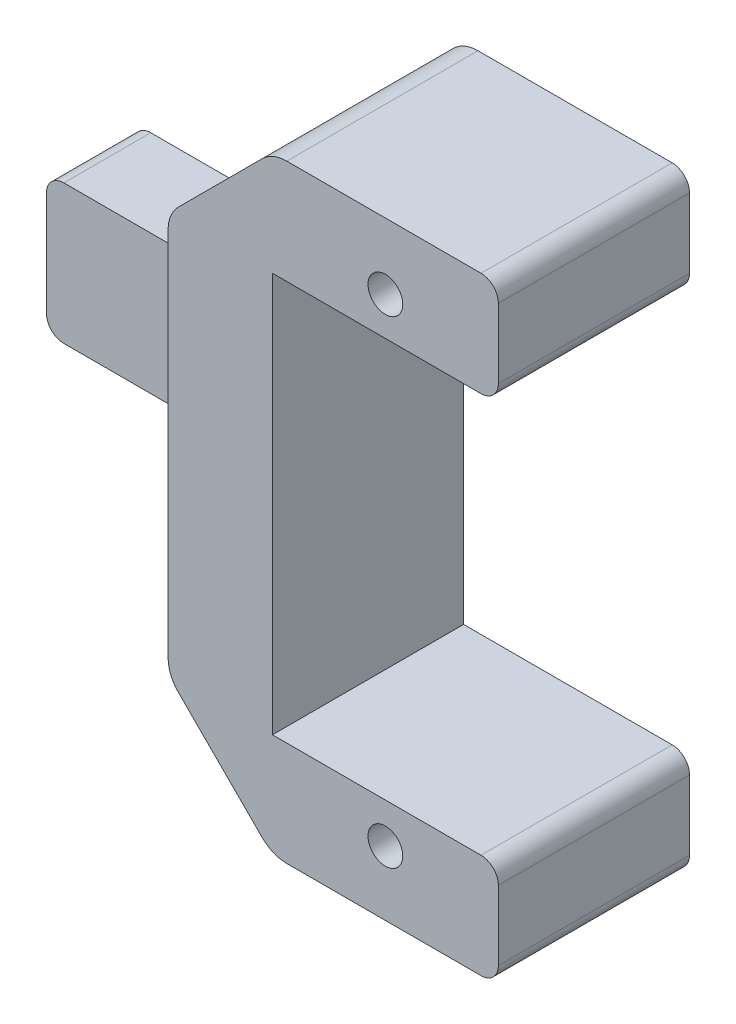
ISO-10303-21;
HEADER;
FILE_DESCRIPTION(('STEP AP214'),'2;1');
FILE_NAME('part.step','',(''),(''),'','','');
FILE_SCHEMA(('AUTOMOTIVE_DESIGN { 1 0 10303 214 1 1 1 1 }'));
ENDSEC;
DATA;
#1=APPLICATION_CONTEXT('core data for automotive mechanical design processes');
#2=APPLICATION_PROTOCOL_DEFINITION('international standard','automotive_design',2000,#1);
#3=PRODUCT_CONTEXT('',#1,'mechanical');
#4=PRODUCT('Part','Part','',(#3));
#5=PRODUCT_RELATED_PRODUCT_CATEGORY('part','',(#4));
#6=PRODUCT_DEFINITION_FORMATION('','',#4);
#7=PRODUCT_DEFINITION_CONTEXT('part definition',#1,'design');
#8=PRODUCT_DEFINITION('design','',#6,#7);
#9=PRODUCT_DEFINITION_SHAPE('','',#8);
#10=(LENGTH_UNIT() NAMED_UNIT(*) SI_UNIT(.MILLI.,.METRE.));
#11=(NAMED_UNIT(*) PLANE_ANGLE_UNIT() SI_UNIT($,.RADIAN.));
#12=(NAMED_UNIT(*) SI_UNIT($,.STERADIAN.) SOLID_ANGLE_UNIT());
#13=UNCERTAINTY_MEASURE_WITH_UNIT(LENGTH_MEASURE(1.E-05),#10,'distance_accuracy_value','');
#14=(GEOMETRIC_REPRESENTATION_CONTEXT(3) GLOBAL_UNCERTAINTY_ASSIGNED_CONTEXT((#13)) GLOBAL_UNIT_ASSIGNED_CONTEXT((#10,
#11,#12)) REPRESENTATION_CONTEXT('',''));
#15=CARTESIAN_POINT('',(0.,0.,0.));
#16=DIRECTION('',(0.,0.,1.));
#17=DIRECTION('',(1.,0.,0.));
#18=AXIS2_PLACEMENT_3D('',#15,#16,#17);
#19=CARTESIAN_POINT('',(-72.397881044612,25.5979659021644,11.));
#20=DIRECTION('',(0.,-1.,0.));
#21=DIRECTION('',(0.,0.,-1.));
#22=AXIS2_PLACEMENT_3D('',#19,#20,#21);
#23=PLANE('',#22);
#24=CARTESIAN_POINT('',(-78.897881044612,25.5979659021644,2.));
#25=DIRECTION('',(0.,1.,0.));
#26=DIRECTION('',(0.,0.,1.));
#27=AXIS2_PLACEMENT_3D('',#24,#25,#26);
#28=CIRCLE('',#27,0.999999999999998);
#29=CARTESIAN_POINT('',(-78.897881044612,25.5979659021644,3.));
#30=VERTEX_POINT('',#29);
#31=EDGE_CURVE('E272',#30,#30,#28,.T.);
#32=ORIENTED_EDGE('',*,*,#31,.F.);
#33=EDGE_LOOP('',(#32));
#34=FACE_BOUND('',#33,.T.);
#35=DIRECTION('',(-1.,0.,0.));
#36=VECTOR('',#35,1.);
#37=CARTESIAN_POINT('',(-72.397881044612,25.5979659021644,5.));
#38=LINE('',#37,#36);
#39=CARTESIAN_POINT('',(-72.397881044612,25.5979659021644,5.));
#40=VERTEX_POINT('',#39);
#41=CARTESIAN_POINT('',(-84.397881044612,25.5979659021644,5.));
#42=VERTEX_POINT('',#41);
#43=EDGE_CURVE('E205',#40,#42,#38,.T.);
#44=ORIENTED_EDGE('',*,*,#43,.F.);
#45=DIRECTION('',(0.,0.,-1.));
#46=VECTOR('',#45,1.);
#47=CARTESIAN_POINT('',(-72.397881044612,25.5979659021644,11.));
#48=LINE('',#47,#46);
#49=CARTESIAN_POINT('',(-72.397881044612,25.5979659021644,0.));
#50=VERTEX_POINT('',#49);
#51=EDGE_CURVE('E202',#40,#50,#48,.T.);
#52=ORIENTED_EDGE('',*,*,#51,.T.);
#53=DIRECTION('',(-1.,0.,0.));
#54=VECTOR('',#53,1.);
#55=CARTESIAN_POINT('',(-72.397881044612,25.5979659021644,0.));
#56=LINE('',#55,#54);
#57=CARTESIAN_POINT('',(-84.397881044612,25.5979659021644,0.));
#58=VERTEX_POINT('',#57);
#59=EDGE_CURVE('E315',#50,#58,#56,.T.);
#60=ORIENTED_EDGE('',*,*,#59,.T.);
#61=DIRECTION('',(0.,0.,-1.));
#62=VECTOR('',#61,1.);
#63=CARTESIAN_POINT('',(-84.397881044612,25.5979659021644,11.));
#64=LINE('',#63,#62);
#65=EDGE_CURVE('E234',#42,#58,#64,.T.);
#66=ORIENTED_EDGE('',*,*,#65,.F.);
#67=EDGE_LOOP('',(#44,#52,#60,#66));
#68=FACE_BOUND('',#67,.T.);
#69=ADVANCED_FACE('F33',(#34,#68),#23,.F.);
#70=CARTESIAN_POINT('',(-84.397881044612,24.5979659021644,11.));
#71=DIRECTION('',(0.,0.,-1.));
#72=DIRECTION('',(-1.,0.,0.));
#73=AXIS2_PLACEMENT_3D('',#70,#71,#72);
#74=CYLINDRICAL_SURFACE('',#73,1.);
#75=CARTESIAN_POINT('',(-84.397881044612,24.5979659021644,5.));
#76=DIRECTION('',(0.,0.,1.));
#77=DIRECTION('',(1.,0.,0.));
#78=AXIS2_PLACEMENT_3D('',#75,#76,#77);
#79=CIRCLE('',#78,1.);
#80=CARTESIAN_POINT('',(-85.397881044612,24.5979659021644,5.));
#81=VERTEX_POINT('',#80);
#82=EDGE_CURVE('E518',#42,#81,#79,.T.);
#83=ORIENTED_EDGE('',*,*,#82,.F.);
#84=ORIENTED_EDGE('',*,*,#65,.T.);
#85=CARTESIAN_POINT('',(-84.397881044612,24.5979659021644,0.));
#86=DIRECTION('',(0.,0.,1.));
#87=DIRECTION('',(1.,0.,0.));
#88=AXIS2_PLACEMENT_3D('',#85,#86,#87);
#89=CIRCLE('',#88,1.);
#90=CARTESIAN_POINT('',(-85.397881044612,24.5979659021644,0.));
#91=VERTEX_POINT('',#90);
#92=EDGE_CURVE('E323',#58,#91,#89,.T.);
#93=ORIENTED_EDGE('',*,*,#92,.T.);
#94=DIRECTION('',(0.,0.,-1.));
#95=VECTOR('',#94,1.);
#96=CARTESIAN_POINT('',(-85.397881044612,24.5979659021644,11.));
#97=LINE('',#96,#95);
#98=EDGE_CURVE('E232',#81,#91,#97,.T.);
#99=ORIENTED_EDGE('',*,*,#98,.F.);
#100=EDGE_LOOP('',(#83,#84,#93,#99));
#101=FACE_BOUND('',#100,.T.);
#102=ADVANCED_FACE('F410',(#101),#74,.T.);
#103=CARTESIAN_POINT('',(-85.397881044612,24.5979659021644,11.));
#104=DIRECTION('',(1.,0.,0.));
#105=DIRECTION('',(0.,0.,-1.));
#106=AXIS2_PLACEMENT_3D('',#103,#104,#105);
#107=PLANE('',#106);
#108=DIRECTION('',(0.,-1.,0.));
#109=VECTOR('',#108,1.);
#110=CARTESIAN_POINT('',(-85.397881044612,24.5979659021644,5.));
#111=LINE('',#110,#109);
#112=CARTESIAN_POINT('',(-85.397881044612,18.5979659021645,5.));
#113=VERTEX_POINT('',#112);
#114=EDGE_CURVE('E514',#81,#113,#111,.T.);
#115=ORIENTED_EDGE('',*,*,#114,.F.);
#116=ORIENTED_EDGE('',*,*,#98,.T.);
#117=DIRECTION('',(0.,-1.,0.));
#118=VECTOR('',#117,1.);
#119=CARTESIAN_POINT('',(-85.397881044612,24.5979659021644,0.));
#120=LINE('',#119,#118);
#121=CARTESIAN_POINT('',(-85.397881044612,18.5979659021645,0.));
#122=VERTEX_POINT('',#121);
#123=EDGE_CURVE('E326',#91,#122,#120,.T.);
#124=ORIENTED_EDGE('',*,*,#123,.T.);
#125=DIRECTION('',(0.,0.,-1.));
#126=VECTOR('',#125,1.);
#127=CARTESIAN_POINT('',(-85.397881044612,18.5979659021645,11.));
#128=LINE('',#127,#126);
#129=EDGE_CURVE('E222',#113,#122,#128,.T.);
#130=ORIENTED_EDGE('',*,*,#129,.F.);
#131=EDGE_LOOP('',(#115,#116,#124,#130));
#132=FACE_BOUND('',#131,.T.);
#133=ADVANCED_FACE('F416',(#132),#107,.F.);
#134=CARTESIAN_POINT('',(-84.397881044612,18.5979659021644,11.));
#135=DIRECTION('',(0.,0.,-1.));
#136=DIRECTION('',(-1.,0.,0.));
#137=AXIS2_PLACEMENT_3D('',#134,#135,#136);
#138=CYLINDRICAL_SURFACE('',#137,1.);
#139=CARTESIAN_POINT('',(-84.397881044612,18.5979659021645,5.));
#140=DIRECTION('',(0.,0.,1.));
#141=DIRECTION('',(1.,0.,0.));
#142=AXIS2_PLACEMENT_3D('',#139,#140,#141);
#143=CIRCLE('',#142,1.00000000000001);
#144=CARTESIAN_POINT('',(-84.397881044612,17.5979659021644,5.));
#145=VERTEX_POINT('',#144);
#146=EDGE_CURVE('E211',#113,#145,#143,.T.);
#147=ORIENTED_EDGE('',*,*,#146,.F.);
#148=ORIENTED_EDGE('',*,*,#129,.T.);
#149=CARTESIAN_POINT('',(-84.397881044612,18.5979659021644,0.));
#150=DIRECTION('',(0.,0.,1.));
#151=DIRECTION('',(1.,0.,0.));
#152=AXIS2_PLACEMENT_3D('',#149,#150,#151);
#153=CIRCLE('',#152,1.);
#154=CARTESIAN_POINT('',(-84.397881044612,17.5979659021644,0.));
#155=VERTEX_POINT('',#154);
#156=EDGE_CURVE('E329',#122,#155,#153,.T.);
#157=ORIENTED_EDGE('',*,*,#156,.T.);
#158=DIRECTION('',(0.,0.,-1.));
#159=VECTOR('',#158,1.);
#160=CARTESIAN_POINT('',(-84.397881044612,17.5979659021644,11.));
#161=LINE('',#160,#159);
#162=EDGE_CURVE('E219',#145,#155,#161,.T.);
#163=ORIENTED_EDGE('',*,*,#162,.F.);
#164=EDGE_LOOP('',(#147,#148,#157,#163));
#165=FACE_BOUND('',#164,.T.);
#166=ADVANCED_FACE('F509',(#165),#138,.T.);
#167=CARTESIAN_POINT('',(-84.397881044612,17.5979659021644,11.));
#168=DIRECTION('',(0.,1.,0.));
#169=DIRECTION('',(0.,0.,1.));
#170=AXIS2_PLACEMENT_3D('',#167,#168,#169);
#171=PLANE('',#170);
#172=CARTESIAN_POINT('',(-78.897881044612,17.5979659021644,2.));
#173=DIRECTION('',(0.,1.,0.));
#174=DIRECTION('',(0.,0.,1.));
#175=AXIS2_PLACEMENT_3D('',#172,#173,#174);
#176=CIRCLE('',#175,0.999999999999998);
#177=CARTESIAN_POINT('',(-78.897881044612,17.5979659021644,3.));
#178=VERTEX_POINT('',#177);
#179=EDGE_CURVE('E268',#178,#178,#176,.T.);
#180=ORIENTED_EDGE('',*,*,#179,.T.);
#181=EDGE_LOOP('',(#180));
#182=FACE_BOUND('',#181,.T.);
#183=DIRECTION('',(1.,0.,0.));
#184=VECTOR('',#183,1.);
#185=CARTESIAN_POINT('',(-84.397881044612,17.5979659021644,5.));
#186=LINE('',#185,#184);
#187=CARTESIAN_POINT('',(-72.397881044612,17.5979659021644,5.));
#188=VERTEX_POINT('',#187);
#189=EDGE_CURVE('E206',#145,#188,#186,.T.);
#190=ORIENTED_EDGE('',*,*,#189,.F.);
#191=ORIENTED_EDGE('',*,*,#162,.T.);
#192=DIRECTION('',(1.,0.,0.));
#193=VECTOR('',#192,1.);
#194=CARTESIAN_POINT('',(-84.397881044612,17.5979659021644,0.));
#195=LINE('',#194,#193);
#196=CARTESIAN_POINT('',(-72.397881044612,17.5979659021644,0.));
#197=VERTEX_POINT('',#196);
#198=EDGE_CURVE('E217',#155,#197,#195,.T.);
#199=ORIENTED_EDGE('',*,*,#198,.T.);
#200=DIRECTION('',(0.,0.,-1.));
#201=VECTOR('',#200,1.);
#202=CARTESIAN_POINT('',(-72.397881044612,17.5979659021644,11.));
#203=LINE('',#202,#201);
#204=EDGE_CURVE('E199',#188,#197,#203,.T.);
#205=ORIENTED_EDGE('',*,*,#204,.F.);
#206=EDGE_LOOP('',(#190,#191,#199,#205));
#207=FACE_BOUND('',#206,.T.);
#208=ADVANCED_FACE('F215',(#182,#207),#171,.F.);
#209=CARTESIAN_POINT('',(-72.397881044612,10.0979659021644,11.));
#210=DIRECTION('',(0.707106781186547,0.707106781186548,0.));
#211=DIRECTION('',(-0.707106781186548,0.707106781186547,0.));
#212=AXIS2_PLACEMENT_3D('',#209,#210,#211);
#213=PLANE('',#212);
#214=DIRECTION('',(0.707106781186548,-0.707106781186547,0.));
#215=VECTOR('',#214,1.);
#216=CARTESIAN_POINT('',(-72.397881044612,10.0979659021644,0.));
#217=LINE('',#216,#215);
#218=CARTESIAN_POINT('',(-71.8120946069851,9.51217946453754,0.));
#219=VERTEX_POINT('',#218);
#220=CARTESIAN_POINT('',(-66.9836674822389,4.68375233979136,0.));
#221=VERTEX_POINT('',#220);
#222=EDGE_CURVE('E364',#219,#221,#217,.T.);
#223=ORIENTED_EDGE('',*,*,#222,.T.);
#224=DIRECTION('',(0.,0.,-1.));
#225=VECTOR('',#224,1.);
#226=CARTESIAN_POINT('',(-66.9836674822389,4.68375233979136,11.));
#227=LINE('',#226,#225);
#228=CARTESIAN_POINT('',(-66.9836674822389,4.68375233979136,11.));
#229=VERTEX_POINT('',#228);
#230=EDGE_CURVE('E286',#221,#229,#227,.F.);
#231=ORIENTED_EDGE('',*,*,#230,.T.);
#232=DIRECTION('',(0.707106781186548,-0.707106781186547,0.));
#233=VECTOR('',#232,1.);
#234=CARTESIAN_POINT('',(-72.397881044612,10.0979659021644,11.));
#235=LINE('',#234,#233);
#236=CARTESIAN_POINT('',(-71.8120946069851,9.51217946453754,11.));
#237=VERTEX_POINT('',#236);
#238=EDGE_CURVE('E331',#237,#229,#235,.T.);
#239=ORIENTED_EDGE('',*,*,#238,.F.);
#240=DIRECTION('',(0.,0.,-1.));
#241=VECTOR('',#240,1.);
#242=CARTESIAN_POINT('',(-71.8120946069851,9.51217946453754,11.));
#243=LINE('',#242,#241);
#244=EDGE_CURVE('E283',#237,#219,#243,.T.);
#245=ORIENTED_EDGE('',*,*,#244,.T.);
#246=EDGE_LOOP('',(#223,#231,#239,#245));
#247=FACE_BOUND('',#246,.T.);
#248=ADVANCED_FACE('F464',(#247),#213,.F.);
#249=CARTESIAN_POINT('',(-66.397881044612,4.09796590216445,11.));
#250=DIRECTION('',(0.,1.,0.));
#251=DIRECTION('',(0.,0.,1.));
#252=AXIS2_PLACEMENT_3D('',#249,#250,#251);
#253=PLANE('',#252);
#254=DIRECTION('',(1.,0.,0.));
#255=VECTOR('',#254,1.);
#256=CARTESIAN_POINT('',(-66.397881044612,4.09796590216445,11.));
#257=LINE('',#256,#255);
#258=CARTESIAN_POINT('',(-65.5694539198658,4.09796590216445,11.));
#259=VERTEX_POINT('',#258);
#260=CARTESIAN_POINT('',(-54.397881044612,4.09796590216445,11.));
#261=VERTEX_POINT('',#260);
#262=EDGE_CURVE('E334',#259,#261,#257,.T.);
#263=ORIENTED_EDGE('',*,*,#262,.F.);
#264=DIRECTION('',(0.,0.,-1.));
#265=VECTOR('',#264,1.);
#266=CARTESIAN_POINT('',(-65.5694539198658,4.09796590216445,11.));
#267=LINE('',#266,#265);
#268=CARTESIAN_POINT('',(-65.5694539198658,4.09796590216445,0.));
#269=VERTEX_POINT('',#268);
#270=EDGE_CURVE('E267',#259,#269,#267,.T.);
#271=ORIENTED_EDGE('',*,*,#270,.T.);
#272=DIRECTION('',(1.,0.,0.));
#273=VECTOR('',#272,1.);
#274=CARTESIAN_POINT('',(-66.397881044612,4.09796590216445,0.));
#275=LINE('',#274,#273);
#276=CARTESIAN_POINT('',(-54.397881044612,4.09796590216445,0.));
#277=VERTEX_POINT('',#276);
#278=EDGE_CURVE('E367',#269,#277,#275,.T.);
#279=ORIENTED_EDGE('',*,*,#278,.T.);
#280=DIRECTION('',(0.,0.,-1.));
#281=VECTOR('',#280,1.);
#282=CARTESIAN_POINT('',(-54.397881044612,4.09796590216445,11.));
#283=LINE('',#282,#281);
#284=EDGE_CURVE('E264',#261,#277,#283,.T.);
#285=ORIENTED_EDGE('',*,*,#284,.F.);
#286=EDGE_LOOP('',(#263,#271,#279,#285));
#287=FACE_BOUND('',#286,.T.);
#288=ADVANCED_FACE('F460',(#287),#253,.F.);
#289=CARTESIAN_POINT('',(-54.397881044612,5.09796590216445,11.));
#290=DIRECTION('',(0.,0.,-1.));
#291=DIRECTION('',(-1.,0.,0.));
#292=AXIS2_PLACEMENT_3D('',#289,#290,#291);
#293=CYLINDRICAL_SURFACE('',#292,1.);
#294=CARTESIAN_POINT('',(-54.397881044612,5.09796590216445,0.));
#295=DIRECTION('',(0.,0.,1.));
#296=DIRECTION('',(1.,0.,0.));
#297=AXIS2_PLACEMENT_3D('',#294,#295,#296);
#298=CIRCLE('',#297,1.);
#299=CARTESIAN_POINT('',(-53.397881044612,5.09796590216445,0.));
#300=VERTEX_POINT('',#299);
#301=EDGE_CURVE('E370',#277,#300,#298,.T.);
#302=ORIENTED_EDGE('',*,*,#301,.T.);
#303=DIRECTION('',(0.,0.,-1.));
#304=VECTOR('',#303,1.);
#305=CARTESIAN_POINT('',(-53.397881044612,5.09796590216445,11.));
#306=LINE('',#305,#304);
#307=CARTESIAN_POINT('',(-53.397881044612,5.09796590216445,11.));
#308=VERTEX_POINT('',#307);
#309=EDGE_CURVE('E261',#308,#300,#306,.T.);
#310=ORIENTED_EDGE('',*,*,#309,.F.);
#311=CARTESIAN_POINT('',(-54.397881044612,5.09796590216445,11.));
#312=DIRECTION('',(0.,0.,1.));
#313=DIRECTION('',(1.,0.,0.));
#314=AXIS2_PLACEMENT_3D('',#311,#312,#313);
#315=CIRCLE('',#314,1.);
#316=EDGE_CURVE('E338',#261,#308,#315,.T.);
#317=ORIENTED_EDGE('',*,*,#316,.F.);
#318=ORIENTED_EDGE('',*,*,#284,.T.);
#319=EDGE_LOOP('',(#302,#310,#317,#318));
#320=FACE_BOUND('',#319,.T.);
#321=ADVANCED_FACE('F456',(#320),#293,.T.);
#322=CARTESIAN_POINT('',(-53.397881044612,5.09796590216445,11.));
#323=DIRECTION('',(-1.,0.,0.));
#324=DIRECTION('',(0.,0.,1.));
#325=AXIS2_PLACEMENT_3D('',#322,#323,#324);
#326=PLANE('',#325);
#327=DIRECTION('',(0.,1.,0.));
#328=VECTOR('',#327,1.);
#329=CARTESIAN_POINT('',(-53.397881044612,5.09796590216445,0.));
#330=LINE('',#329,#328);
#331=CARTESIAN_POINT('',(-53.397881044612,9.09796590216444,0.));
#332=VERTEX_POINT('',#331);
#333=EDGE_CURVE('E372',#300,#332,#330,.T.);
#334=ORIENTED_EDGE('',*,*,#333,.T.);
#335=DIRECTION('',(0.,0.,-1.));
#336=VECTOR('',#335,1.);
#337=CARTESIAN_POINT('',(-53.397881044612,9.09796590216444,11.));
#338=LINE('',#337,#336);
#339=CARTESIAN_POINT('',(-53.397881044612,9.09796590216444,11.));
#340=VERTEX_POINT('',#339);
#341=EDGE_CURVE('E258',#340,#332,#338,.T.);
#342=ORIENTED_EDGE('',*,*,#341,.F.);
#343=DIRECTION('',(0.,1.,0.));
#344=VECTOR('',#343,1.);
#345=CARTESIAN_POINT('',(-53.397881044612,5.09796590216445,11.));
#346=LINE('',#345,#344);
#347=EDGE_CURVE('E345',#308,#340,#346,.T.);
#348=ORIENTED_EDGE('',*,*,#347,.F.);
#349=ORIENTED_EDGE('',*,*,#309,.T.);
#350=EDGE_LOOP('',(#334,#342,#348,#349));
#351=FACE_BOUND('',#350,.T.);
#352=ADVANCED_FACE('F452',(#351),#326,.F.);
#353=CARTESIAN_POINT('',(-54.397881044612,9.09796590216445,11.));
#354=DIRECTION('',(0.,0.,-1.));
#355=DIRECTION('',(-1.,0.,0.));
#356=AXIS2_PLACEMENT_3D('',#353,#354,#355);
#357=CYLINDRICAL_SURFACE('',#356,1.);
#358=CARTESIAN_POINT('',(-54.397881044612,9.09796590216445,0.));
#359=DIRECTION('',(0.,0.,1.));
#360=DIRECTION('',(1.,0.,0.));
#361=AXIS2_PLACEMENT_3D('',#358,#359,#360);
#362=CIRCLE('',#361,1.);
#363=CARTESIAN_POINT('',(-54.397881044612,10.0979659021644,0.));
#364=VERTEX_POINT('',#363);
#365=EDGE_CURVE('E374',#332,#364,#362,.T.);
#366=ORIENTED_EDGE('',*,*,#365,.T.);
#367=DIRECTION('',(0.,0.,-1.));
#368=VECTOR('',#367,1.);
#369=CARTESIAN_POINT('',(-54.397881044612,10.0979659021644,11.));
#370=LINE('',#369,#368);
#371=CARTESIAN_POINT('',(-54.397881044612,10.0979659021644,11.));
#372=VERTEX_POINT('',#371);
#373=EDGE_CURVE('E255',#372,#364,#370,.T.);
#374=ORIENTED_EDGE('',*,*,#373,.F.);
#375=CARTESIAN_POINT('',(-54.397881044612,9.09796590216445,11.));
#376=DIRECTION('',(0.,0.,1.));
#377=DIRECTION('',(1.,0.,0.));
#378=AXIS2_PLACEMENT_3D('',#375,#376,#377);
#379=CIRCLE('',#378,1.);
#380=EDGE_CURVE('E347',#340,#372,#379,.T.);
#381=ORIENTED_EDGE('',*,*,#380,.F.);
#382=ORIENTED_EDGE('',*,*,#341,.T.);
#383=EDGE_LOOP('',(#366,#374,#381,#382));
#384=FACE_BOUND('',#383,.T.);
#385=ADVANCED_FACE('F448',(#384),#357,.T.);
#386=CARTESIAN_POINT('',(-54.397881044612,10.0979659021644,11.));
#387=DIRECTION('',(0.,-1.,0.));
#388=DIRECTION('',(1.,0.,0.));
#389=AXIS2_PLACEMENT_3D('',#386,#387,#388);
#390=PLANE('',#389);
#391=DIRECTION('',(-1.,0.,0.));
#392=VECTOR('',#391,1.);
#393=CARTESIAN_POINT('',(-54.397881044612,10.0979659021644,0.));
#394=LINE('',#393,#392);
#395=CARTESIAN_POINT('',(-66.397881044612,10.0979659021644,0.));
#396=VERTEX_POINT('',#395);
#397=EDGE_CURVE('E376',#364,#396,#394,.T.);
#398=ORIENTED_EDGE('',*,*,#397,.T.);
#399=DIRECTION('',(0.,0.,-1.));
#400=VECTOR('',#399,1.);
#401=CARTESIAN_POINT('',(-66.397881044612,10.0979659021644,11.));
#402=LINE('',#401,#400);
#403=CARTESIAN_POINT('',(-66.397881044612,10.0979659021644,11.));
#404=VERTEX_POINT('',#403);
#405=EDGE_CURVE('E252',#404,#396,#402,.T.);
#406=ORIENTED_EDGE('',*,*,#405,.F.);
#407=DIRECTION('',(-1.,0.,0.));
#408=VECTOR('',#407,1.);
#409=CARTESIAN_POINT('',(-54.397881044612,10.0979659021644,11.));
#410=LINE('',#409,#408);
#411=EDGE_CURVE('E349',#372,#404,#410,.T.);
#412=ORIENTED_EDGE('',*,*,#411,.F.);
#413=ORIENTED_EDGE('',*,*,#373,.T.);
#414=EDGE_LOOP('',(#398,#406,#412,#413));
#415=FACE_BOUND('',#414,.T.);
#416=ADVANCED_FACE('F444',(#415),#390,.F.);
#417=CARTESIAN_POINT('',(-66.397881044612,10.0979659021644,11.));
#418=DIRECTION('',(-1.,0.,0.));
#419=DIRECTION('',(0.,0.,1.));
#420=AXIS2_PLACEMENT_3D('',#417,#418,#419);
#421=PLANE('',#420);
#422=DIRECTION('',(0.,1.,0.));
#423=VECTOR('',#422,1.);
#424=CARTESIAN_POINT('',(-66.397881044612,10.0979659021644,0.));
#425=LINE('',#424,#423);
#426=CARTESIAN_POINT('',(-66.397881044612,33.0979659021644,0.));
#427=VERTEX_POINT('',#426);
#428=EDGE_CURVE('E378',#396,#427,#425,.T.);
#429=ORIENTED_EDGE('',*,*,#428,.T.);
#430=DIRECTION('',(0.,0.,-1.));
#431=VECTOR('',#430,1.);
#432=CARTESIAN_POINT('',(-66.397881044612,33.0979659021644,11.));
#433=LINE('',#432,#431);
#434=CARTESIAN_POINT('',(-66.397881044612,33.0979659021644,11.));
#435=VERTEX_POINT('',#434);
#436=EDGE_CURVE('E249',#435,#427,#433,.T.);
#437=ORIENTED_EDGE('',*,*,#436,.F.);
#438=DIRECTION('',(0.,1.,0.));
#439=VECTOR('',#438,1.);
#440=CARTESIAN_POINT('',(-66.397881044612,10.0979659021644,11.));
#441=LINE('',#440,#439);
#442=EDGE_CURVE('E351',#404,#435,#441,.T.);
#443=ORIENTED_EDGE('',*,*,#442,.F.);
#444=ORIENTED_EDGE('',*,*,#405,.T.);
#445=EDGE_LOOP('',(#429,#437,#443,#444));
#446=FACE_BOUND('',#445,.T.);
#447=ADVANCED_FACE('F440',(#446),#421,.F.);
#448=CARTESIAN_POINT('',(-66.397881044612,33.0979659021644,11.));
#449=DIRECTION('',(0.,1.,0.));
#450=DIRECTION('',(0.,0.,1.));
#451=AXIS2_PLACEMENT_3D('',#448,#449,#450);
#452=PLANE('',#451);
#453=DIRECTION('',(1.,0.,0.));
#454=VECTOR('',#453,1.);
#455=CARTESIAN_POINT('',(-66.397881044612,33.0979659021644,0.));
#456=LINE('',#455,#454);
#457=CARTESIAN_POINT('',(-54.397881044612,33.0979659021644,0.));
#458=VERTEX_POINT('',#457);
#459=EDGE_CURVE('E380',#427,#458,#456,.T.);
#460=ORIENTED_EDGE('',*,*,#459,.T.);
#461=DIRECTION('',(0.,0.,-1.));
#462=VECTOR('',#461,1.);
#463=CARTESIAN_POINT('',(-54.397881044612,33.0979659021644,11.));
#464=LINE('',#463,#462);
#465=CARTESIAN_POINT('',(-54.397881044612,33.0979659021644,11.));
#466=VERTEX_POINT('',#465);
#467=EDGE_CURVE('E246',#466,#458,#464,.T.);
#468=ORIENTED_EDGE('',*,*,#467,.F.);
#469=DIRECTION('',(1.,0.,0.));
#470=VECTOR('',#469,1.);
#471=CARTESIAN_POINT('',(-66.397881044612,33.0979659021644,11.));
#472=LINE('',#471,#470);
#473=EDGE_CURVE('E353',#435,#466,#472,.T.);
#474=ORIENTED_EDGE('',*,*,#473,.F.);
#475=ORIENTED_EDGE('',*,*,#436,.T.);
#476=EDGE_LOOP('',(#460,#468,#474,#475));
#477=FACE_BOUND('',#476,.T.);
#478=ADVANCED_FACE('F436',(#477),#452,.F.);
#479=CARTESIAN_POINT('',(-54.397881044612,34.0979659021644,11.));
#480=DIRECTION('',(0.,0.,-1.));
#481=DIRECTION('',(-1.,0.,0.));
#482=AXIS2_PLACEMENT_3D('',#479,#480,#481);
#483=CYLINDRICAL_SURFACE('',#482,1.);
#484=CARTESIAN_POINT('',(-54.397881044612,34.0979659021644,0.));
#485=DIRECTION('',(0.,0.,1.));
#486=DIRECTION('',(1.,0.,0.));
#487=AXIS2_PLACEMENT_3D('',#484,#485,#486);
#488=CIRCLE('',#487,1.);
#489=CARTESIAN_POINT('',(-53.397881044612,34.0979659021645,0.));
#490=VERTEX_POINT('',#489);
#491=EDGE_CURVE('E382',#458,#490,#488,.T.);
#492=ORIENTED_EDGE('',*,*,#491,.T.);
#493=DIRECTION('',(0.,0.,-1.));
#494=VECTOR('',#493,1.);
#495=CARTESIAN_POINT('',(-53.397881044612,34.0979659021645,11.));
#496=LINE('',#495,#494);
#497=CARTESIAN_POINT('',(-53.397881044612,34.0979659021645,11.));
#498=VERTEX_POINT('',#497);
#499=EDGE_CURVE('E243',#498,#490,#496,.T.);
#500=ORIENTED_EDGE('',*,*,#499,.F.);
#501=CARTESIAN_POINT('',(-54.397881044612,34.0979659021644,11.));
#502=DIRECTION('',(0.,0.,1.));
#503=DIRECTION('',(1.,0.,0.));
#504=AXIS2_PLACEMENT_3D('',#501,#502,#503);
#505=CIRCLE('',#504,1.);
#506=EDGE_CURVE('E355',#466,#498,#505,.T.);
#507=ORIENTED_EDGE('',*,*,#506,.F.);
#508=ORIENTED_EDGE('',*,*,#467,.T.);
#509=EDGE_LOOP('',(#492,#500,#507,#508));
#510=FACE_BOUND('',#509,.T.);
#511=ADVANCED_FACE('F432',(#510),#483,.T.);
#512=CARTESIAN_POINT('',(-53.397881044612,34.0979659021645,11.));
#513=DIRECTION('',(-1.,0.,0.));
#514=DIRECTION('',(0.,0.,1.));
#515=AXIS2_PLACEMENT_3D('',#512,#513,#514);
#516=PLANE('',#515);
#517=DIRECTION('',(0.,1.,0.));
#518=VECTOR('',#517,1.);
#519=CARTESIAN_POINT('',(-53.397881044612,34.0979659021645,0.));
#520=LINE('',#519,#518);
#521=CARTESIAN_POINT('',(-53.397881044612,38.0979659021644,0.));
#522=VERTEX_POINT('',#521);
#523=EDGE_CURVE('E384',#490,#522,#520,.T.);
#524=ORIENTED_EDGE('',*,*,#523,.T.);
#525=DIRECTION('',(0.,0.,-1.));
#526=VECTOR('',#525,1.);
#527=CARTESIAN_POINT('',(-53.397881044612,38.0979659021644,11.));
#528=LINE('',#527,#526);
#529=CARTESIAN_POINT('',(-53.397881044612,38.0979659021644,11.));
#530=VERTEX_POINT('',#529);
#531=EDGE_CURVE('E240',#530,#522,#528,.T.);
#532=ORIENTED_EDGE('',*,*,#531,.F.);
#533=DIRECTION('',(0.,1.,0.));
#534=VECTOR('',#533,1.);
#535=CARTESIAN_POINT('',(-53.397881044612,34.0979659021645,11.));
#536=LINE('',#535,#534);
#537=EDGE_CURVE('E357',#498,#530,#536,.T.);
#538=ORIENTED_EDGE('',*,*,#537,.F.);
#539=ORIENTED_EDGE('',*,*,#499,.T.);
#540=EDGE_LOOP('',(#524,#532,#538,#539));
#541=FACE_BOUND('',#540,.T.);
#542=ADVANCED_FACE('F429',(#541),#516,.F.);
#543=CARTESIAN_POINT('',(-54.397881044612,38.0979659021644,11.));
#544=DIRECTION('',(0.,0.,-1.));
#545=DIRECTION('',(-1.,0.,0.));
#546=AXIS2_PLACEMENT_3D('',#543,#544,#545);
#547=CYLINDRICAL_SURFACE('',#546,1.);
#548=CARTESIAN_POINT('',(-54.397881044612,38.0979659021644,0.));
#549=DIRECTION('',(0.,0.,1.));
#550=DIRECTION('',(-1.,0.,0.));
#551=AXIS2_PLACEMENT_3D('',#548,#549,#550);
#552=CIRCLE('',#551,1.);
#553=CARTESIAN_POINT('',(-54.397881044612,39.0979659021644,0.));
#554=VERTEX_POINT('',#553);
#555=EDGE_CURVE('E317',#522,#554,#552,.T.);
#556=ORIENTED_EDGE('',*,*,#555,.T.);
#557=DIRECTION('',(0.,0.,-1.));
#558=VECTOR('',#557,1.);
#559=CARTESIAN_POINT('',(-54.397881044612,39.0979659021644,11.));
#560=LINE('',#559,#558);
#561=CARTESIAN_POINT('',(-54.397881044612,39.0979659021644,11.));
#562=VERTEX_POINT('',#561);
#563=EDGE_CURVE('E237',#562,#554,#560,.T.);
#564=ORIENTED_EDGE('',*,*,#563,.F.);
#565=CARTESIAN_POINT('',(-54.397881044612,38.0979659021644,11.));
#566=DIRECTION('',(0.,0.,1.));
#567=DIRECTION('',(-1.,0.,0.));
#568=AXIS2_PLACEMENT_3D('',#565,#566,#567);
#569=CIRCLE('',#568,1.);
#570=EDGE_CURVE('E359',#530,#562,#569,.T.);
#571=ORIENTED_EDGE('',*,*,#570,.F.);
#572=ORIENTED_EDGE('',*,*,#531,.T.);
#573=EDGE_LOOP('',(#556,#564,#571,#572));
#574=FACE_BOUND('',#573,.T.);
#575=ADVANCED_FACE('F388',(#574),#547,.T.);
#576=CARTESIAN_POINT('',(-54.397881044612,39.0979659021644,11.));
#577=DIRECTION('',(0.,-1.,0.));
#578=DIRECTION('',(0.,0.,-1.));
#579=AXIS2_PLACEMENT_3D('',#576,#577,#578);
#580=PLANE('',#579);
#581=DIRECTION('',(-1.,0.,0.));
#582=VECTOR('',#581,1.);
#583=CARTESIAN_POINT('',(-54.397881044612,39.0979659021644,0.));
#584=LINE('',#583,#582);
#585=CARTESIAN_POINT('',(-65.5694539198658,39.0979659021644,0.));
#586=VERTEX_POINT('',#585);
#587=EDGE_CURVE('E313',#554,#586,#584,.T.);
#588=ORIENTED_EDGE('',*,*,#587,.T.);
#589=DIRECTION('',(0.,0.,-1.));
#590=VECTOR('',#589,1.);
#591=CARTESIAN_POINT('',(-65.5694539198658,39.0979659021644,11.));
#592=LINE('',#591,#590);
#593=CARTESIAN_POINT('',(-65.5694539198658,39.0979659021644,11.));
#594=VERTEX_POINT('',#593);
#595=EDGE_CURVE('E11',#586,#594,#592,.F.);
#596=ORIENTED_EDGE('',*,*,#595,.T.);
#597=DIRECTION('',(-1.,0.,0.));
#598=VECTOR('',#597,1.);
#599=CARTESIAN_POINT('',(-54.397881044612,39.0979659021644,11.));
#600=LINE('',#599,#598);
#601=EDGE_CURVE('E361',#562,#594,#600,.T.);
#602=ORIENTED_EDGE('',*,*,#601,.F.);
#603=ORIENTED_EDGE('',*,*,#563,.T.);
#604=EDGE_LOOP('',(#588,#596,#602,#603));
#605=FACE_BOUND('',#604,.T.);
#606=ADVANCED_FACE('F394',(#605),#580,.F.);
#607=CARTESIAN_POINT('',(-66.397881044612,39.0979659021644,11.));
#608=DIRECTION('',(0.707106781186547,-0.707106781186548,0.));
#609=DIRECTION('',(0.707106781186548,0.707106781186547,0.));
#610=AXIS2_PLACEMENT_3D('',#607,#608,#609);
#611=PLANE('',#610);
#612=DIRECTION('',(-0.707106781186548,-0.707106781186547,0.));
#613=VECTOR('',#612,1.);
#614=CARTESIAN_POINT('',(-66.397881044612,39.0979659021644,11.));
#615=LINE('',#614,#613);
#616=CARTESIAN_POINT('',(-66.9836674822389,38.5121794645375,11.));
#617=VERTEX_POINT('',#616);
#618=CARTESIAN_POINT('',(-71.8120946069851,33.6837523397914,11.));
#619=VERTEX_POINT('',#618);
#620=EDGE_CURVE('E225',#617,#619,#615,.T.);
#621=ORIENTED_EDGE('',*,*,#620,.F.);
#622=DIRECTION('',(0.,0.,-1.));
#623=VECTOR('',#622,1.);
#624=CARTESIAN_POINT('',(-66.9836674822389,38.5121794645375,11.));
#625=LINE('',#624,#623);
#626=CARTESIAN_POINT('',(-66.9836674822389,38.5121794645375,0.));
#627=VERTEX_POINT('',#626);
#628=EDGE_CURVE('E41',#617,#627,#625,.T.);
#629=ORIENTED_EDGE('',*,*,#628,.T.);
#630=DIRECTION('',(-0.707106781186548,-0.707106781186547,0.));
#631=VECTOR('',#630,1.);
#632=CARTESIAN_POINT('',(-66.397881044612,39.0979659021644,0.));
#633=LINE('',#632,#631);
#634=CARTESIAN_POINT('',(-71.8120946069851,33.6837523397914,0.));
#635=VERTEX_POINT('',#634);
#636=EDGE_CURVE('E304',#627,#635,#633,.T.);
#637=ORIENTED_EDGE('',*,*,#636,.T.);
#638=DIRECTION('',(0.,0.,-1.));
#639=VECTOR('',#638,1.);
#640=CARTESIAN_POINT('',(-71.8120946069851,33.6837523397914,11.));
#641=LINE('',#640,#639);
#642=EDGE_CURVE('E48',#635,#619,#641,.F.);
#643=ORIENTED_EDGE('',*,*,#642,.T.);
#644=EDGE_LOOP('',(#621,#629,#637,#643));
#645=FACE_BOUND('',#644,.T.);
#646=ADVANCED_FACE('F303',(#645),#611,.F.);
#647=CARTESIAN_POINT('',(-72.397881044612,10.0979659021644,11.));
#648=DIRECTION('',(1.,0.,0.));
#649=DIRECTION('',(0.,0.,-1.));
#650=AXIS2_PLACEMENT_3D('',#647,#648,#649);
#651=PLANE('',#650);
#652=DIRECTION('',(0.,-1.,0.));
#653=VECTOR('',#652,1.);
#654=CARTESIAN_POINT('',(-72.397881044612,10.0979659021644,0.));
#655=LINE('',#654,#653);
#656=CARTESIAN_POINT('',(-72.397881044612,10.9263930269106,0.));
#657=VERTEX_POINT('',#656);
#658=EDGE_CURVE('E228',#197,#657,#655,.T.);
#659=ORIENTED_EDGE('',*,*,#658,.T.);
#660=DIRECTION('',(0.,0.,-1.));
#661=VECTOR('',#660,1.);
#662=CARTESIAN_POINT('',(-72.397881044612,10.9263930269106,11.));
#663=LINE('',#662,#661);
#664=CARTESIAN_POINT('',(-72.397881044612,10.9263930269106,11.));
#665=VERTEX_POINT('',#664);
#666=EDGE_CURVE('E298',#657,#665,#663,.F.);
#667=ORIENTED_EDGE('',*,*,#666,.T.);
#668=DIRECTION('',(0.,-1.,0.));
#669=VECTOR('',#668,1.);
#670=CARTESIAN_POINT('',(-72.397881044612,33.0979659021644,11.));
#671=LINE('',#670,#669);
#672=CARTESIAN_POINT('',(-72.397881044612,32.2695387774183,11.));
#673=VERTEX_POINT('',#672);
#674=EDGE_CURVE('E220',#673,#665,#671,.T.);
#675=ORIENTED_EDGE('',*,*,#674,.F.);
#676=DIRECTION('',(0.,0.,-1.));
#677=VECTOR('',#676,1.);
#678=CARTESIAN_POINT('',(-72.397881044612,32.2695387774183,11.));
#679=LINE('',#678,#677);
#680=CARTESIAN_POINT('',(-72.397881044612,32.2695387774183,0.));
#681=VERTEX_POINT('',#680);
#682=EDGE_CURVE('E295',#673,#681,#679,.T.);
#683=ORIENTED_EDGE('',*,*,#682,.T.);
#684=DIRECTION('',(0.,-1.,0.));
#685=VECTOR('',#684,1.);
#686=CARTESIAN_POINT('',(-72.397881044612,33.0979659021644,0.));
#687=LINE('',#686,#685);
#688=EDGE_CURVE('E312',#681,#50,#687,.T.);
#689=ORIENTED_EDGE('',*,*,#688,.T.);
#690=ORIENTED_EDGE('',*,*,#51,.F.);
#691=DIRECTION('',(0.,1.,0.));
#692=VECTOR('',#691,1.);
#693=CARTESIAN_POINT('',(-72.397881044612,17.5979659021644,5.));
#694=LINE('',#693,#692);
#695=EDGE_CURVE('E194',#188,#40,#694,.T.);
#696=ORIENTED_EDGE('',*,*,#695,.F.);
#697=ORIENTED_EDGE('',*,*,#204,.T.);
#698=EDGE_LOOP('',(#659,#667,#675,#683,#689,#690,#696,#697));
#699=FACE_BOUND('',#698,.T.);
#700=ADVANCED_FACE('F197',(#699),#651,.F.);
#701=CARTESIAN_POINT('',(-54.397881044612,5.09796590216445,11.));
#702=DIRECTION('',(0.,0.,1.));
#703=DIRECTION('',(1.,0.,0.));
#704=AXIS2_PLACEMENT_3D('',#701,#702,#703);
#705=PLANE('',#704);
#706=ORIENTED_EDGE('',*,*,#238,.T.);
#707=CARTESIAN_POINT('',(-65.5694539198658,6.09796590216445,11.));
#708=DIRECTION('',(0.,0.,1.));
#709=DIRECTION('',(1.,0.,0.));
#710=AXIS2_PLACEMENT_3D('',#707,#708,#709);
#711=CIRCLE('',#710,2.);
#712=EDGE_CURVE('E293',#229,#259,#711,.T.);
#713=ORIENTED_EDGE('',*,*,#712,.T.);
#714=ORIENTED_EDGE('',*,*,#262,.T.);
#715=ORIENTED_EDGE('',*,*,#316,.T.);
#716=ORIENTED_EDGE('',*,*,#347,.T.);
#717=ORIENTED_EDGE('',*,*,#380,.T.);
#718=ORIENTED_EDGE('',*,*,#411,.T.);
#719=ORIENTED_EDGE('',*,*,#442,.T.);
#720=ORIENTED_EDGE('',*,*,#473,.T.);
#721=ORIENTED_EDGE('',*,*,#506,.T.);
#722=ORIENTED_EDGE('',*,*,#537,.T.);
#723=ORIENTED_EDGE('',*,*,#570,.T.);
#724=ORIENTED_EDGE('',*,*,#601,.T.);
#725=CARTESIAN_POINT('',(-65.5694539198658,37.0979659021644,11.));
#726=DIRECTION('',(0.,0.,1.));
#727=DIRECTION('',(1.,0.,0.));
#728=AXIS2_PLACEMENT_3D('',#725,#726,#727);
#729=CIRCLE('',#728,2.);
#730=EDGE_CURVE('E55',#594,#617,#729,.T.);
#731=ORIENTED_EDGE('',*,*,#730,.T.);
#732=ORIENTED_EDGE('',*,*,#620,.T.);
#733=CARTESIAN_POINT('',(-70.397881044612,32.2695387774183,11.));
#734=DIRECTION('',(0.,0.,1.));
#735=DIRECTION('',(1.,0.,0.));
#736=AXIS2_PLACEMENT_3D('',#733,#734,#735);
#737=CIRCLE('',#736,2.);
#738=EDGE_CURVE('E288',#619,#673,#737,.T.);
#739=ORIENTED_EDGE('',*,*,#738,.T.);
#740=ORIENTED_EDGE('',*,*,#674,.T.);
#741=CARTESIAN_POINT('',(-70.397881044612,10.9263930269106,11.));
#742=DIRECTION('',(0.,0.,1.));
#743=DIRECTION('',(1.,0.,0.));
#744=AXIS2_PLACEMENT_3D('',#741,#742,#743);
#745=CIRCLE('',#744,2.);
#746=EDGE_CURVE('E291',#665,#237,#745,.T.);
#747=ORIENTED_EDGE('',*,*,#746,.T.);
#748=EDGE_LOOP('',(#706,#713,#714,#715,#716,#717,#718,#719,#720,#721,#722,#723,#724,#731,#732,
#739,#740,#747));
#749=FACE_BOUND('',#748,.T.);
#750=CARTESIAN_POINT('',(-59.897881044612,7.80272595148067,11.));
#751=DIRECTION('',(0.,0.,1.));
#752=DIRECTION('',(1.,0.,0.));
#753=AXIS2_PLACEMENT_3D('',#750,#751,#752);
#754=CIRCLE('',#753,0.999999999999998);
#755=CARTESIAN_POINT('',(-58.897881044612,7.80272595148067,11.));
#756=VERTEX_POINT('',#755);
#757=EDGE_CURVE('E271',#756,#756,#754,.T.);
#758=ORIENTED_EDGE('',*,*,#757,.F.);
#759=EDGE_LOOP('',(#758));
#760=FACE_BOUND('',#759,.T.);
#761=CARTESIAN_POINT('',(-59.897881044612,35.2939852780087,11.));
#762=DIRECTION('',(0.,0.,1.));
#763=DIRECTION('',(1.,0.,0.));
#764=AXIS2_PLACEMENT_3D('',#761,#762,#763);
#765=CIRCLE('',#764,0.999999999999998);
#766=CARTESIAN_POINT('',(-58.897881044612,35.2939852780087,11.));
#767=VERTEX_POINT('',#766);
#768=EDGE_CURVE('E341',#767,#767,#765,.T.);
#769=ORIENTED_EDGE('',*,*,#768,.F.);
#770=EDGE_LOOP('',(#769));
#771=FACE_BOUND('',#770,.T.);
#772=ADVANCED_FACE('F396',(#749,#760,#771),#705,.T.);
#773=CARTESIAN_POINT('',(-54.397881044612,5.09796590216445,0.));
#774=DIRECTION('',(0.,0.,1.));
#775=DIRECTION('',(1.,0.,0.));
#776=AXIS2_PLACEMENT_3D('',#773,#774,#775);
#777=PLANE('',#776);
#778=CARTESIAN_POINT('',(-59.897881044612,7.80272595148067,0.));
#779=DIRECTION('',(0.,0.,1.));
#780=DIRECTION('',(1.,0.,0.));
#781=AXIS2_PLACEMENT_3D('',#778,#779,#780);
#782=CIRCLE('',#781,0.999999999999998);
#783=CARTESIAN_POINT('',(-58.897881044612,7.80272595148067,0.));
#784=VERTEX_POINT('',#783);
#785=EDGE_CURVE('E526',#784,#784,#782,.T.);
#786=ORIENTED_EDGE('',*,*,#785,.T.);
#787=EDGE_LOOP('',(#786));
#788=FACE_BOUND('',#787,.T.);
#789=CARTESIAN_POINT('',(-59.897881044612,35.2939852780087,0.));
#790=DIRECTION('',(0.,0.,1.));
#791=DIRECTION('',(1.,0.,0.));
#792=AXIS2_PLACEMENT_3D('',#789,#790,#791);
#793=CIRCLE('',#792,0.999999999999998);
#794=CARTESIAN_POINT('',(-58.897881044612,35.2939852780087,0.));
#795=VERTEX_POINT('',#794);
#796=EDGE_CURVE('E368',#795,#795,#793,.T.);
#797=ORIENTED_EDGE('',*,*,#796,.T.);
#798=EDGE_LOOP('',(#797));
#799=FACE_BOUND('',#798,.T.);
#800=ORIENTED_EDGE('',*,*,#278,.F.);
#801=CARTESIAN_POINT('',(-65.5694539198658,6.09796590216445,0.));
#802=DIRECTION('',(0.,0.,1.));
#803=DIRECTION('',(1.,0.,0.));
#804=AXIS2_PLACEMENT_3D('',#801,#802,#803);
#805=CIRCLE('',#804,2.);
#806=EDGE_CURVE('E281',#269,#221,#805,.F.);
#807=ORIENTED_EDGE('',*,*,#806,.T.);
#808=ORIENTED_EDGE('',*,*,#222,.F.);
#809=CARTESIAN_POINT('',(-70.397881044612,10.9263930269106,0.));
#810=DIRECTION('',(0.,0.,1.));
#811=DIRECTION('',(1.,0.,0.));
#812=AXIS2_PLACEMENT_3D('',#809,#810,#811);
#813=CIRCLE('',#812,2.);
#814=EDGE_CURVE('E279',#219,#657,#813,.F.);
#815=ORIENTED_EDGE('',*,*,#814,.T.);
#816=ORIENTED_EDGE('',*,*,#658,.F.);
#817=ORIENTED_EDGE('',*,*,#198,.F.);
#818=ORIENTED_EDGE('',*,*,#156,.F.);
#819=ORIENTED_EDGE('',*,*,#123,.F.);
#820=ORIENTED_EDGE('',*,*,#92,.F.);
#821=ORIENTED_EDGE('',*,*,#59,.F.);
#822=ORIENTED_EDGE('',*,*,#688,.F.);
#823=CARTESIAN_POINT('',(-70.397881044612,32.2695387774183,0.));
#824=DIRECTION('',(0.,0.,1.));
#825=DIRECTION('',(1.,0.,0.));
#826=AXIS2_PLACEMENT_3D('',#823,#824,#825);
#827=CIRCLE('',#826,2.);
#828=EDGE_CURVE('E275',#681,#635,#827,.F.);
#829=ORIENTED_EDGE('',*,*,#828,.T.);
#830=ORIENTED_EDGE('',*,*,#636,.F.);
#831=CARTESIAN_POINT('',(-65.5694539198658,37.0979659021644,0.));
#832=DIRECTION('',(0.,0.,1.));
#833=DIRECTION('',(1.,0.,0.));
#834=AXIS2_PLACEMENT_3D('',#831,#832,#833);
#835=CIRCLE('',#834,2.);
#836=EDGE_CURVE('E277',#627,#586,#835,.F.);
#837=ORIENTED_EDGE('',*,*,#836,.T.);
#838=ORIENTED_EDGE('',*,*,#587,.F.);
#839=ORIENTED_EDGE('',*,*,#555,.F.);
#840=ORIENTED_EDGE('',*,*,#523,.F.);
#841=ORIENTED_EDGE('',*,*,#491,.F.);
#842=ORIENTED_EDGE('',*,*,#459,.F.);
#843=ORIENTED_EDGE('',*,*,#428,.F.);
#844=ORIENTED_EDGE('',*,*,#397,.F.);
#845=ORIENTED_EDGE('',*,*,#365,.F.);
#846=ORIENTED_EDGE('',*,*,#333,.F.);
#847=ORIENTED_EDGE('',*,*,#301,.F.);
#848=EDGE_LOOP('',(#800,#807,#808,#815,#816,#817,#818,#819,#820,#821,#822,#829,#830,#837,#838,
#839,#840,#841,#842,#843,#844,#845,#846,#847));
#849=FACE_BOUND('',#848,.T.);
#850=ADVANCED_FACE('F308',(#788,#799,#849),#777,.F.);
#851=CARTESIAN_POINT('',(-59.897881044612,35.2939852780087,0.));
#852=DIRECTION('',(0.,0.,1.));
#853=DIRECTION('',(1.,0.,0.));
#854=AXIS2_PLACEMENT_3D('',#851,#852,#853);
#855=CYLINDRICAL_SURFACE('',#854,0.999999999999998);
#856=ORIENTED_EDGE('',*,*,#796,.F.);
#857=EDGE_LOOP('',(#856));
#858=FACE_BOUND('',#857,.T.);
#859=ORIENTED_EDGE('',*,*,#768,.T.);
#860=EDGE_LOOP('',(#859));
#861=FACE_BOUND('',#860,.T.);
#862=ADVANCED_FACE('F536',(#858,#861),#855,.F.);
#863=CARTESIAN_POINT('',(-59.897881044612,7.80272595148067,0.));
#864=DIRECTION('',(0.,0.,1.));
#865=DIRECTION('',(1.,0.,0.));
#866=AXIS2_PLACEMENT_3D('',#863,#864,#865);
#867=CYLINDRICAL_SURFACE('',#866,0.999999999999998);
#868=ORIENTED_EDGE('',*,*,#785,.F.);
#869=EDGE_LOOP('',(#868));
#870=FACE_BOUND('',#869,.T.);
#871=ORIENTED_EDGE('',*,*,#757,.T.);
#872=EDGE_LOOP('',(#871));
#873=FACE_BOUND('',#872,.T.);
#874=ADVANCED_FACE('F672',(#870,#873),#867,.F.);
#875=CARTESIAN_POINT('',(-78.897881044612,15.5979659021644,2.));
#876=DIRECTION('',(0.,1.,0.));
#877=DIRECTION('',(0.,0.,1.));
#878=AXIS2_PLACEMENT_3D('',#875,#876,#877);
#879=CYLINDRICAL_SURFACE('',#878,0.999999999999998);
#880=ORIENTED_EDGE('',*,*,#31,.T.);
#881=EDGE_LOOP('',(#880));
#882=FACE_BOUND('',#881,.T.);
#883=ORIENTED_EDGE('',*,*,#179,.F.);
#884=EDGE_LOOP('',(#883));
#885=FACE_BOUND('',#884,.T.);
#886=ADVANCED_FACE('F474',(#882,#885),#879,.F.);
#887=CARTESIAN_POINT('',(-84.397881044612,24.5979659021644,5.));
#888=DIRECTION('',(0.,0.,1.));
#889=DIRECTION('',(1.,0.,0.));
#890=AXIS2_PLACEMENT_3D('',#887,#888,#889);
#891=PLANE('',#890);
#892=ORIENTED_EDGE('',*,*,#189,.T.);
#893=ORIENTED_EDGE('',*,*,#695,.T.);
#894=ORIENTED_EDGE('',*,*,#43,.T.);
#895=ORIENTED_EDGE('',*,*,#82,.T.);
#896=ORIENTED_EDGE('',*,*,#114,.T.);
#897=ORIENTED_EDGE('',*,*,#146,.T.);
#898=EDGE_LOOP('',(#892,#893,#894,#895,#896,#897));
#899=FACE_BOUND('',#898,.T.);
#900=ADVANCED_FACE('F209',(#899),#891,.T.);
#901=CARTESIAN_POINT('',(-65.5694539198658,6.09796590216445,11.));
#902=DIRECTION('',(0.,0.,-1.));
#903=DIRECTION('',(-1.,0.,0.));
#904=AXIS2_PLACEMENT_3D('',#901,#902,#903);
#905=CYLINDRICAL_SURFACE('',#904,2.);
#906=ORIENTED_EDGE('',*,*,#712,.F.);
#907=ORIENTED_EDGE('',*,*,#230,.F.);
#908=ORIENTED_EDGE('',*,*,#806,.F.);
#909=ORIENTED_EDGE('',*,*,#270,.F.);
#910=EDGE_LOOP('',(#906,#907,#908,#909));
#911=FACE_BOUND('',#910,.T.);
#912=ADVANCED_FACE('F406',(#911),#905,.T.);
#913=CARTESIAN_POINT('',(-70.397881044612,10.9263930269106,11.));
#914=DIRECTION('',(0.,0.,-1.));
#915=DIRECTION('',(-1.,0.,0.));
#916=AXIS2_PLACEMENT_3D('',#913,#914,#915);
#917=CYLINDRICAL_SURFACE('',#916,2.);
#918=ORIENTED_EDGE('',*,*,#746,.F.);
#919=ORIENTED_EDGE('',*,*,#666,.F.);
#920=ORIENTED_EDGE('',*,*,#814,.F.);
#921=ORIENTED_EDGE('',*,*,#244,.F.);
#922=EDGE_LOOP('',(#918,#919,#920,#921));
#923=FACE_BOUND('',#922,.T.);
#924=ADVANCED_FACE('F400',(#923),#917,.T.);
#925=CARTESIAN_POINT('',(-65.5694539198658,37.0979659021644,11.));
#926=DIRECTION('',(0.,0.,-1.));
#927=DIRECTION('',(-1.,0.,0.));
#928=AXIS2_PLACEMENT_3D('',#925,#926,#927);
#929=CYLINDRICAL_SURFACE('',#928,2.);
#930=ORIENTED_EDGE('',*,*,#730,.F.);
#931=ORIENTED_EDGE('',*,*,#595,.F.);
#932=ORIENTED_EDGE('',*,*,#836,.F.);
#933=ORIENTED_EDGE('',*,*,#628,.F.);
#934=EDGE_LOOP('',(#930,#931,#932,#933));
#935=FACE_BOUND('',#934,.T.);
#936=ADVANCED_FACE('F398',(#935),#929,.T.);
#937=CARTESIAN_POINT('',(-70.397881044612,32.2695387774183,11.));
#938=DIRECTION('',(0.,0.,-1.));
#939=DIRECTION('',(-1.,0.,0.));
#940=AXIS2_PLACEMENT_3D('',#937,#938,#939);
#941=CYLINDRICAL_SURFACE('',#940,2.);
#942=ORIENTED_EDGE('',*,*,#738,.F.);
#943=ORIENTED_EDGE('',*,*,#642,.F.);
#944=ORIENTED_EDGE('',*,*,#828,.F.);
#945=ORIENTED_EDGE('',*,*,#682,.F.);
#946=EDGE_LOOP('',(#942,#943,#944,#945));
#947=FACE_BOUND('',#946,.T.);
#948=ADVANCED_FACE('F35',(#947),#941,.T.);
#949=CLOSED_SHELL('',(#69,#102,#133,#166,#208,#248,#288,#321,#352,#385,#416,#447,#478,#511,#542,
#575,#606,#646,#700,#772,#850,#862,#874,#886,#900,#912,#924,#936,#948));
#950=MANIFOLD_SOLID_BREP('B2',#949);
#951=ADVANCED_BREP_SHAPE_REPRESENTATION('',(#18,#950),#14);
#952=SHAPE_DEFINITION_REPRESENTATION(#9,#951);
ENDSEC;
END-ISO-10303-21;
